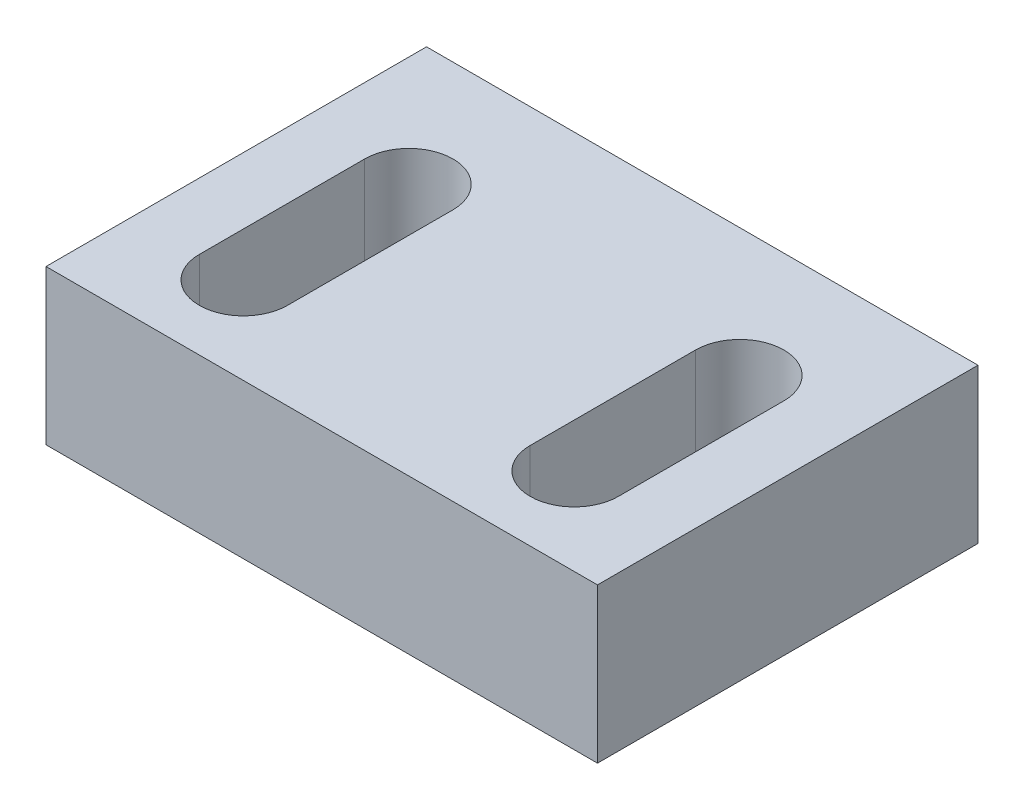
ISO-10303-21;
HEADER;
FILE_DESCRIPTION(('STEP AP214'),'2;1');
FILE_NAME('part.step','',(''),(''),'','','');
FILE_SCHEMA(('AUTOMOTIVE_DESIGN { 1 0 10303 214 1 1 1 1 }'));
ENDSEC;
DATA;
#1=APPLICATION_CONTEXT('core data for automotive mechanical design processes');
#2=APPLICATION_PROTOCOL_DEFINITION('international standard','automotive_design',2000,#1);
#3=PRODUCT_CONTEXT('',#1,'mechanical');
#4=PRODUCT('Part','Part','',(#3));
#5=PRODUCT_RELATED_PRODUCT_CATEGORY('part','',(#4));
#6=PRODUCT_DEFINITION_FORMATION('','',#4);
#7=PRODUCT_DEFINITION_CONTEXT('part definition',#1,'design');
#8=PRODUCT_DEFINITION('design','',#6,#7);
#9=PRODUCT_DEFINITION_SHAPE('','',#8);
#10=(LENGTH_UNIT() NAMED_UNIT(*) SI_UNIT(.MILLI.,.METRE.));
#11=(NAMED_UNIT(*) PLANE_ANGLE_UNIT() SI_UNIT($,.RADIAN.));
#12=(NAMED_UNIT(*) SI_UNIT($,.STERADIAN.) SOLID_ANGLE_UNIT());
#13=UNCERTAINTY_MEASURE_WITH_UNIT(LENGTH_MEASURE(1.E-05),#10,'distance_accuracy_value','');
#14=(GEOMETRIC_REPRESENTATION_CONTEXT(3) GLOBAL_UNCERTAINTY_ASSIGNED_CONTEXT((#13)) GLOBAL_UNIT_ASSIGNED_CONTEXT((#10,
#11,#12)) REPRESENTATION_CONTEXT('',''));
#15=CARTESIAN_POINT('',(0.,0.,0.));
#16=DIRECTION('',(0.,0.,1.));
#17=DIRECTION('',(1.,0.,0.));
#18=AXIS2_PLACEMENT_3D('',#15,#16,#17);
#19=CARTESIAN_POINT('',(0.,7.,0.));
#20=DIRECTION('',(0.,1.,0.));
#21=DIRECTION('',(0.,0.,1.));
#22=AXIS2_PLACEMENT_3D('',#19,#20,#21);
#23=PLANE('',#22);
#24=DIRECTION('',(0.,0.,-1.));
#25=VECTOR('',#24,1.);
#26=CARTESIAN_POINT('',(25.,7.,-17.25));
#27=LINE('',#26,#25);
#28=CARTESIAN_POINT('',(25.,7.,17.25));
#29=VERTEX_POINT('',#28);
#30=CARTESIAN_POINT('',(25.,7.,-17.25));
#31=VERTEX_POINT('',#30);
#32=EDGE_CURVE('E220',#29,#31,#27,.T.);
#33=ORIENTED_EDGE('',*,*,#32,.T.);
#34=DIRECTION('',(-1.,0.,0.));
#35=VECTOR('',#34,1.);
#36=CARTESIAN_POINT('',(-25.,7.,-17.25));
#37=LINE('',#36,#35);
#38=CARTESIAN_POINT('',(-25.,7.,-17.25));
#39=VERTEX_POINT('',#38);
#40=EDGE_CURVE('E224',#31,#39,#37,.T.);
#41=ORIENTED_EDGE('',*,*,#40,.T.);
#42=DIRECTION('',(0.,0.,1.));
#43=VECTOR('',#42,1.);
#44=CARTESIAN_POINT('',(-25.,7.,-17.25));
#45=LINE('',#44,#43);
#46=CARTESIAN_POINT('',(-25.,7.,17.25));
#47=VERTEX_POINT('',#46);
#48=EDGE_CURVE('E228',#39,#47,#45,.T.);
#49=ORIENTED_EDGE('',*,*,#48,.T.);
#50=DIRECTION('',(1.,0.,0.));
#51=VECTOR('',#50,1.);
#52=CARTESIAN_POINT('',(-25.,7.,17.25));
#53=LINE('',#52,#51);
#54=EDGE_CURVE('E231',#47,#29,#53,.T.);
#55=ORIENTED_EDGE('',*,*,#54,.T.);
#56=EDGE_LOOP('',(#33,#41,#49,#55));
#57=FACE_BOUND('',#56,.T.);
#58=DIRECTION('',(0.,0.,1.));
#59=VECTOR('',#58,1.);
#60=CARTESIAN_POINT('',(-19.,7.,-5.6462730239689));
#61=LINE('',#60,#59);
#62=CARTESIAN_POINT('',(-19.,7.,-5.6462730239689));
#63=VERTEX_POINT('',#62);
#64=CARTESIAN_POINT('',(-19.,7.,9.35372697603109));
#65=VERTEX_POINT('',#64);
#66=EDGE_CURVE('E180',#63,#65,#61,.T.);
#67=ORIENTED_EDGE('',*,*,#66,.F.);
#68=CARTESIAN_POINT('',(-15.,7.,-5.6462730239689));
#69=DIRECTION('',(0.,1.,0.));
#70=DIRECTION('',(0.,0.,1.));
#71=AXIS2_PLACEMENT_3D('',#68,#69,#70);
#72=CIRCLE('',#71,4.);
#73=CARTESIAN_POINT('',(-11.,7.,-5.64627302396891));
#74=VERTEX_POINT('',#73);
#75=EDGE_CURVE('E177',#74,#63,#72,.T.);
#76=ORIENTED_EDGE('',*,*,#75,.F.);
#77=DIRECTION('',(0.,0.,-1.));
#78=VECTOR('',#77,1.);
#79=CARTESIAN_POINT('',(-11.,7.,-5.64627302396891));
#80=LINE('',#79,#78);
#81=CARTESIAN_POINT('',(-11.,7.,9.35372697603109));
#82=VERTEX_POINT('',#81);
#83=EDGE_CURVE('E188',#82,#74,#80,.T.);
#84=ORIENTED_EDGE('',*,*,#83,.F.);
#85=CARTESIAN_POINT('',(-15.,7.,9.35372697603109));
#86=DIRECTION('',(0.,1.,0.));
#87=DIRECTION('',(0.,0.,1.));
#88=AXIS2_PLACEMENT_3D('',#85,#86,#87);
#89=CIRCLE('',#88,4.);
#90=EDGE_CURVE('E184',#65,#82,#89,.T.);
#91=ORIENTED_EDGE('',*,*,#90,.F.);
#92=EDGE_LOOP('',(#67,#76,#84,#91));
#93=FACE_BOUND('',#92,.T.);
#94=DIRECTION('',(0.,0.,1.));
#95=VECTOR('',#94,1.);
#96=CARTESIAN_POINT('',(11.,7.,-5.64627302396889));
#97=LINE('',#96,#95);
#98=CARTESIAN_POINT('',(11.,7.,-5.64627302396889));
#99=VERTEX_POINT('',#98);
#100=CARTESIAN_POINT('',(11.,7.,9.35372697603111));
#101=VERTEX_POINT('',#100);
#102=EDGE_CURVE('E137',#99,#101,#97,.T.);
#103=ORIENTED_EDGE('',*,*,#102,.F.);
#104=CARTESIAN_POINT('',(15.,7.,-5.64627302396889));
#105=DIRECTION('',(0.,1.,0.));
#106=DIRECTION('',(0.,0.,-1.));
#107=AXIS2_PLACEMENT_3D('',#104,#105,#106);
#108=CIRCLE('',#107,4.);
#109=CARTESIAN_POINT('',(19.,7.,-5.64627302396888));
#110=VERTEX_POINT('',#109);
#111=EDGE_CURVE('E128',#110,#99,#108,.T.);
#112=ORIENTED_EDGE('',*,*,#111,.F.);
#113=DIRECTION('',(0.,0.,-1.));
#114=VECTOR('',#113,1.);
#115=CARTESIAN_POINT('',(19.,7.,-5.64627302396888));
#116=LINE('',#115,#114);
#117=CARTESIAN_POINT('',(19.,7.,9.35372697603112));
#118=VERTEX_POINT('',#117);
#119=EDGE_CURVE('E155',#118,#110,#116,.T.);
#120=ORIENTED_EDGE('',*,*,#119,.F.);
#121=CARTESIAN_POINT('',(15.,7.,9.35372697603111));
#122=DIRECTION('',(0.,1.,0.));
#123=DIRECTION('',(0.,0.,-1.));
#124=AXIS2_PLACEMENT_3D('',#121,#122,#123);
#125=CIRCLE('',#124,4.);
#126=EDGE_CURVE('E150',#101,#118,#125,.T.);
#127=ORIENTED_EDGE('',*,*,#126,.F.);
#128=EDGE_LOOP('',(#103,#112,#120,#127));
#129=FACE_BOUND('',#128,.T.);
#130=ADVANCED_FACE('F38',(#57,#93,#129),#23,.T.);
#131=CARTESIAN_POINT('',(0.,-7.,0.));
#132=DIRECTION('',(0.,1.,0.));
#133=DIRECTION('',(0.,0.,1.));
#134=AXIS2_PLACEMENT_3D('',#131,#132,#133);
#135=PLANE('',#134);
#136=CARTESIAN_POINT('',(-15.,-7.,-5.6462730239689));
#137=DIRECTION('',(0.,1.,0.));
#138=DIRECTION('',(0.,0.,1.));
#139=AXIS2_PLACEMENT_3D('',#136,#137,#138);
#140=CIRCLE('',#139,4.);
#141=CARTESIAN_POINT('',(-11.,-7.,-5.64627302396891));
#142=VERTEX_POINT('',#141);
#143=CARTESIAN_POINT('',(-19.,-7.,-5.6462730239689));
#144=VERTEX_POINT('',#143);
#145=EDGE_CURVE('E146',#142,#144,#140,.T.);
#146=ORIENTED_EDGE('',*,*,#145,.T.);
#147=DIRECTION('',(0.,0.,1.));
#148=VECTOR('',#147,1.);
#149=CARTESIAN_POINT('',(-19.,-7.,-5.6462730239689));
#150=LINE('',#149,#148);
#151=CARTESIAN_POINT('',(-19.,-7.,9.35372697603109));
#152=VERTEX_POINT('',#151);
#153=EDGE_CURVE('E195',#144,#152,#150,.T.);
#154=ORIENTED_EDGE('',*,*,#153,.T.);
#155=CARTESIAN_POINT('',(-15.,-7.,9.35372697603109));
#156=DIRECTION('',(0.,1.,0.));
#157=DIRECTION('',(0.,0.,1.));
#158=AXIS2_PLACEMENT_3D('',#155,#156,#157);
#159=CIRCLE('',#158,4.);
#160=CARTESIAN_POINT('',(-11.,-7.,9.35372697603109));
#161=VERTEX_POINT('',#160);
#162=EDGE_CURVE('E199',#152,#161,#159,.T.);
#163=ORIENTED_EDGE('',*,*,#162,.T.);
#164=DIRECTION('',(0.,0.,-1.));
#165=VECTOR('',#164,1.);
#166=CARTESIAN_POINT('',(-11.,-7.,-5.64627302396891));
#167=LINE('',#166,#165);
#168=EDGE_CURVE('E181',#161,#142,#167,.T.);
#169=ORIENTED_EDGE('',*,*,#168,.T.);
#170=EDGE_LOOP('',(#146,#154,#163,#169));
#171=FACE_BOUND('',#170,.T.);
#172=DIRECTION('',(0.,0.,-1.));
#173=VECTOR('',#172,1.);
#174=CARTESIAN_POINT('',(25.,-7.,-17.25));
#175=LINE('',#174,#173);
#176=CARTESIAN_POINT('',(25.,-7.,17.25));
#177=VERTEX_POINT('',#176);
#178=CARTESIAN_POINT('',(25.,-7.,-17.25));
#179=VERTEX_POINT('',#178);
#180=EDGE_CURVE('E219',#177,#179,#175,.T.);
#181=ORIENTED_EDGE('',*,*,#180,.F.);
#182=DIRECTION('',(1.,0.,0.));
#183=VECTOR('',#182,1.);
#184=CARTESIAN_POINT('',(-25.,-7.,17.25));
#185=LINE('',#184,#183);
#186=CARTESIAN_POINT('',(-25.,-7.,17.25));
#187=VERTEX_POINT('',#186);
#188=EDGE_CURVE('E225',#187,#177,#185,.T.);
#189=ORIENTED_EDGE('',*,*,#188,.F.);
#190=DIRECTION('',(0.,0.,1.));
#191=VECTOR('',#190,1.);
#192=CARTESIAN_POINT('',(-25.,-7.,-17.25));
#193=LINE('',#192,#191);
#194=CARTESIAN_POINT('',(-25.,-7.,-17.25));
#195=VERTEX_POINT('',#194);
#196=EDGE_CURVE('E241',#195,#187,#193,.T.);
#197=ORIENTED_EDGE('',*,*,#196,.F.);
#198=DIRECTION('',(-1.,0.,0.));
#199=VECTOR('',#198,1.);
#200=CARTESIAN_POINT('',(-25.,-7.,-17.25));
#201=LINE('',#200,#199);
#202=EDGE_CURVE('E238',#179,#195,#201,.T.);
#203=ORIENTED_EDGE('',*,*,#202,.F.);
#204=EDGE_LOOP('',(#181,#189,#197,#203));
#205=FACE_BOUND('',#204,.T.);
#206=CARTESIAN_POINT('',(15.,-7.,-5.64627302396889));
#207=DIRECTION('',(0.,1.,0.));
#208=DIRECTION('',(0.,0.,-1.));
#209=AXIS2_PLACEMENT_3D('',#206,#207,#208);
#210=CIRCLE('',#209,4.);
#211=CARTESIAN_POINT('',(19.,-7.,-5.64627302396888));
#212=VERTEX_POINT('',#211);
#213=CARTESIAN_POINT('',(11.,-7.,-5.64627302396889));
#214=VERTEX_POINT('',#213);
#215=EDGE_CURVE('E62',#212,#214,#210,.T.);
#216=ORIENTED_EDGE('',*,*,#215,.T.);
#217=DIRECTION('',(0.,0.,1.));
#218=VECTOR('',#217,1.);
#219=CARTESIAN_POINT('',(11.,-7.,-5.64627302396889));
#220=LINE('',#219,#218);
#221=CARTESIAN_POINT('',(11.,-7.,9.35372697603111));
#222=VERTEX_POINT('',#221);
#223=EDGE_CURVE('E144',#214,#222,#220,.T.);
#224=ORIENTED_EDGE('',*,*,#223,.T.);
#225=CARTESIAN_POINT('',(15.,-7.,9.35372697603111));
#226=DIRECTION('',(0.,1.,0.));
#227=DIRECTION('',(0.,0.,-1.));
#228=AXIS2_PLACEMENT_3D('',#225,#226,#227);
#229=CIRCLE('',#228,4.);
#230=CARTESIAN_POINT('',(19.,-7.,9.35372697603112));
#231=VERTEX_POINT('',#230);
#232=EDGE_CURVE('E164',#222,#231,#229,.T.);
#233=ORIENTED_EDGE('',*,*,#232,.T.);
#234=DIRECTION('',(0.,0.,-1.));
#235=VECTOR('',#234,1.);
#236=CARTESIAN_POINT('',(19.,-7.,-5.64627302396888));
#237=LINE('',#236,#235);
#238=EDGE_CURVE('E138',#231,#212,#237,.T.);
#239=ORIENTED_EDGE('',*,*,#238,.T.);
#240=EDGE_LOOP('',(#216,#224,#233,#239));
#241=FACE_BOUND('',#240,.T.);
#242=ADVANCED_FACE('F265',(#171,#205,#241),#135,.F.);
#243=CARTESIAN_POINT('',(25.,7.,-17.25));
#244=DIRECTION('',(-1.,0.,0.));
#245=DIRECTION('',(0.,0.,1.));
#246=AXIS2_PLACEMENT_3D('',#243,#244,#245);
#247=PLANE('',#246);
#248=ORIENTED_EDGE('',*,*,#180,.T.);
#249=DIRECTION('',(0.,-1.,0.));
#250=VECTOR('',#249,1.);
#251=CARTESIAN_POINT('',(25.,7.,-17.25));
#252=LINE('',#251,#250);
#253=EDGE_CURVE('E11',#31,#179,#252,.T.);
#254=ORIENTED_EDGE('',*,*,#253,.F.);
#255=ORIENTED_EDGE('',*,*,#32,.F.);
#256=DIRECTION('',(0.,-1.,0.));
#257=VECTOR('',#256,1.);
#258=CARTESIAN_POINT('',(25.,7.,17.25));
#259=LINE('',#258,#257);
#260=EDGE_CURVE('E234',#29,#177,#259,.T.);
#261=ORIENTED_EDGE('',*,*,#260,.T.);
#262=EDGE_LOOP('',(#248,#254,#255,#261));
#263=FACE_BOUND('',#262,.T.);
#264=ADVANCED_FACE('F40',(#263),#247,.F.);
#265=CARTESIAN_POINT('',(-25.,7.,-17.25));
#266=DIRECTION('',(0.,0.,1.));
#267=DIRECTION('',(1.,0.,0.));
#268=AXIS2_PLACEMENT_3D('',#265,#266,#267);
#269=PLANE('',#268);
#270=ORIENTED_EDGE('',*,*,#202,.T.);
#271=DIRECTION('',(0.,-1.,0.));
#272=VECTOR('',#271,1.);
#273=CARTESIAN_POINT('',(-25.,7.,-17.25));
#274=LINE('',#273,#272);
#275=EDGE_CURVE('E47',#39,#195,#274,.T.);
#276=ORIENTED_EDGE('',*,*,#275,.F.);
#277=ORIENTED_EDGE('',*,*,#40,.F.);
#278=ORIENTED_EDGE('',*,*,#253,.T.);
#279=EDGE_LOOP('',(#270,#276,#277,#278));
#280=FACE_BOUND('',#279,.T.);
#281=ADVANCED_FACE('F276',(#280),#269,.F.);
#282=CARTESIAN_POINT('',(-25.,7.,-17.25));
#283=DIRECTION('',(1.,0.,0.));
#284=DIRECTION('',(0.,0.,-1.));
#285=AXIS2_PLACEMENT_3D('',#282,#283,#284);
#286=PLANE('',#285);
#287=ORIENTED_EDGE('',*,*,#196,.T.);
#288=DIRECTION('',(0.,-1.,0.));
#289=VECTOR('',#288,1.);
#290=CARTESIAN_POINT('',(-25.,7.,17.25));
#291=LINE('',#290,#289);
#292=EDGE_CURVE('E249',#47,#187,#291,.T.);
#293=ORIENTED_EDGE('',*,*,#292,.F.);
#294=ORIENTED_EDGE('',*,*,#48,.F.);
#295=ORIENTED_EDGE('',*,*,#275,.T.);
#296=EDGE_LOOP('',(#287,#293,#294,#295));
#297=FACE_BOUND('',#296,.T.);
#298=ADVANCED_FACE('F259',(#297),#286,.F.);
#299=CARTESIAN_POINT('',(-25.,7.,17.25));
#300=DIRECTION('',(0.,0.,-1.));
#301=DIRECTION('',(-1.,0.,0.));
#302=AXIS2_PLACEMENT_3D('',#299,#300,#301);
#303=PLANE('',#302);
#304=ORIENTED_EDGE('',*,*,#188,.T.);
#305=ORIENTED_EDGE('',*,*,#260,.F.);
#306=ORIENTED_EDGE('',*,*,#54,.F.);
#307=ORIENTED_EDGE('',*,*,#292,.T.);
#308=EDGE_LOOP('',(#304,#305,#306,#307));
#309=FACE_BOUND('',#308,.T.);
#310=ADVANCED_FACE('F269',(#309),#303,.F.);
#311=CARTESIAN_POINT('',(-15.,7.,-5.6462730239689));
#312=DIRECTION('',(0.,-1.,0.));
#313=DIRECTION('',(0.,0.,-1.));
#314=AXIS2_PLACEMENT_3D('',#311,#312,#313);
#315=CYLINDRICAL_SURFACE('',#314,4.);
#316=ORIENTED_EDGE('',*,*,#145,.F.);
#317=DIRECTION('',(0.,-1.,0.));
#318=VECTOR('',#317,1.);
#319=CARTESIAN_POINT('',(-11.,7.,-5.64627302396891));
#320=LINE('',#319,#318);
#321=EDGE_CURVE('E191',#74,#142,#320,.T.);
#322=ORIENTED_EDGE('',*,*,#321,.F.);
#323=ORIENTED_EDGE('',*,*,#75,.T.);
#324=DIRECTION('',(0.,-1.,0.));
#325=VECTOR('',#324,1.);
#326=CARTESIAN_POINT('',(-19.,7.,-5.6462730239689));
#327=LINE('',#326,#325);
#328=EDGE_CURVE('E215',#63,#144,#327,.T.);
#329=ORIENTED_EDGE('',*,*,#328,.T.);
#330=EDGE_LOOP('',(#316,#322,#323,#329));
#331=FACE_BOUND('',#330,.T.);
#332=ADVANCED_FACE('F291',(#331),#315,.F.);
#333=CARTESIAN_POINT('',(-19.,7.,-5.6462730239689));
#334=DIRECTION('',(1.,0.,0.));
#335=DIRECTION('',(0.,0.,-1.));
#336=AXIS2_PLACEMENT_3D('',#333,#334,#335);
#337=PLANE('',#336);
#338=ORIENTED_EDGE('',*,*,#153,.F.);
#339=ORIENTED_EDGE('',*,*,#328,.F.);
#340=ORIENTED_EDGE('',*,*,#66,.T.);
#341=DIRECTION('',(0.,-1.,0.));
#342=VECTOR('',#341,1.);
#343=CARTESIAN_POINT('',(-19.,7.,9.35372697603109));
#344=LINE('',#343,#342);
#345=EDGE_CURVE('E212',#65,#152,#344,.T.);
#346=ORIENTED_EDGE('',*,*,#345,.T.);
#347=EDGE_LOOP('',(#338,#339,#340,#346));
#348=FACE_BOUND('',#347,.T.);
#349=ADVANCED_FACE('F298',(#348),#337,.T.);
#350=CARTESIAN_POINT('',(-15.,7.,9.35372697603109));
#351=DIRECTION('',(0.,-1.,0.));
#352=DIRECTION('',(0.,0.,-1.));
#353=AXIS2_PLACEMENT_3D('',#350,#351,#352);
#354=CYLINDRICAL_SURFACE('',#353,4.);
#355=ORIENTED_EDGE('',*,*,#162,.F.);
#356=ORIENTED_EDGE('',*,*,#345,.F.);
#357=ORIENTED_EDGE('',*,*,#90,.T.);
#358=DIRECTION('',(0.,-1.,0.));
#359=VECTOR('',#358,1.);
#360=CARTESIAN_POINT('',(-11.,7.,9.35372697603109));
#361=LINE('',#360,#359);
#362=EDGE_CURVE('E209',#82,#161,#361,.T.);
#363=ORIENTED_EDGE('',*,*,#362,.T.);
#364=EDGE_LOOP('',(#355,#356,#357,#363));
#365=FACE_BOUND('',#364,.T.);
#366=ADVANCED_FACE('F303',(#365),#354,.F.);
#367=CARTESIAN_POINT('',(-11.,7.,-5.64627302396891));
#368=DIRECTION('',(-1.,0.,0.));
#369=DIRECTION('',(0.,0.,1.));
#370=AXIS2_PLACEMENT_3D('',#367,#368,#369);
#371=PLANE('',#370);
#372=ORIENTED_EDGE('',*,*,#168,.F.);
#373=ORIENTED_EDGE('',*,*,#362,.F.);
#374=ORIENTED_EDGE('',*,*,#83,.T.);
#375=ORIENTED_EDGE('',*,*,#321,.T.);
#376=EDGE_LOOP('',(#372,#373,#374,#375));
#377=FACE_BOUND('',#376,.T.);
#378=ADVANCED_FACE('F310',(#377),#371,.T.);
#379=CARTESIAN_POINT('',(15.,7.,-5.64627302396889));
#380=DIRECTION('',(0.,-1.,0.));
#381=DIRECTION('',(0.,0.,-1.));
#382=AXIS2_PLACEMENT_3D('',#379,#380,#381);
#383=CYLINDRICAL_SURFACE('',#382,4.);
#384=ORIENTED_EDGE('',*,*,#215,.F.);
#385=DIRECTION('',(0.,-1.,0.));
#386=VECTOR('',#385,1.);
#387=CARTESIAN_POINT('',(19.,7.,-5.64627302396888));
#388=LINE('',#387,#386);
#389=EDGE_CURVE('E132',#110,#212,#388,.T.);
#390=ORIENTED_EDGE('',*,*,#389,.F.);
#391=ORIENTED_EDGE('',*,*,#111,.T.);
#392=DIRECTION('',(0.,-1.,0.));
#393=VECTOR('',#392,1.);
#394=CARTESIAN_POINT('',(11.,7.,-5.64627302396889));
#395=LINE('',#394,#393);
#396=EDGE_CURVE('E131',#99,#214,#395,.T.);
#397=ORIENTED_EDGE('',*,*,#396,.T.);
#398=EDGE_LOOP('',(#384,#390,#391,#397));
#399=FACE_BOUND('',#398,.T.);
#400=ADVANCED_FACE('F130',(#399),#383,.F.);
#401=CARTESIAN_POINT('',(11.,7.,-5.64627302396889));
#402=DIRECTION('',(1.,0.,0.));
#403=DIRECTION('',(0.,0.,-1.));
#404=AXIS2_PLACEMENT_3D('',#401,#402,#403);
#405=PLANE('',#404);
#406=ORIENTED_EDGE('',*,*,#223,.F.);
#407=ORIENTED_EDGE('',*,*,#396,.F.);
#408=ORIENTED_EDGE('',*,*,#102,.T.);
#409=DIRECTION('',(0.,-1.,0.));
#410=VECTOR('',#409,1.);
#411=CARTESIAN_POINT('',(11.,7.,9.35372697603111));
#412=LINE('',#411,#410);
#413=EDGE_CURVE('E147',#101,#222,#412,.T.);
#414=ORIENTED_EDGE('',*,*,#413,.T.);
#415=EDGE_LOOP('',(#406,#407,#408,#414));
#416=FACE_BOUND('',#415,.T.);
#417=ADVANCED_FACE('F141',(#416),#405,.T.);
#418=CARTESIAN_POINT('',(15.,7.,9.35372697603111));
#419=DIRECTION('',(0.,-1.,0.));
#420=DIRECTION('',(0.,0.,-1.));
#421=AXIS2_PLACEMENT_3D('',#418,#419,#420);
#422=CYLINDRICAL_SURFACE('',#421,4.);
#423=ORIENTED_EDGE('',*,*,#232,.F.);
#424=ORIENTED_EDGE('',*,*,#413,.F.);
#425=ORIENTED_EDGE('',*,*,#126,.T.);
#426=DIRECTION('',(0.,-1.,0.));
#427=VECTOR('',#426,1.);
#428=CARTESIAN_POINT('',(19.,7.,9.35372697603112));
#429=LINE('',#428,#427);
#430=EDGE_CURVE('E54',#118,#231,#429,.T.);
#431=ORIENTED_EDGE('',*,*,#430,.T.);
#432=EDGE_LOOP('',(#423,#424,#425,#431));
#433=FACE_BOUND('',#432,.T.);
#434=ADVANCED_FACE('F328',(#433),#422,.F.);
#435=CARTESIAN_POINT('',(19.,7.,-5.64627302396888));
#436=DIRECTION('',(-1.,0.,0.));
#437=DIRECTION('',(0.,0.,1.));
#438=AXIS2_PLACEMENT_3D('',#435,#436,#437);
#439=PLANE('',#438);
#440=ORIENTED_EDGE('',*,*,#238,.F.);
#441=ORIENTED_EDGE('',*,*,#430,.F.);
#442=ORIENTED_EDGE('',*,*,#119,.T.);
#443=ORIENTED_EDGE('',*,*,#389,.T.);
#444=EDGE_LOOP('',(#440,#441,#442,#443));
#445=FACE_BOUND('',#444,.T.);
#446=ADVANCED_FACE('F331',(#445),#439,.T.);
#447=CLOSED_SHELL('',(#130,#242,#264,#281,#298,#310,#332,#349,#366,#378,#400,#417,#434,#446));
#448=MANIFOLD_SOLID_BREP('B2',#447);
#449=ADVANCED_BREP_SHAPE_REPRESENTATION('',(#18,#448),#14);
#450=SHAPE_DEFINITION_REPRESENTATION(#9,#449);
ENDSEC;
END-ISO-10303-21;
